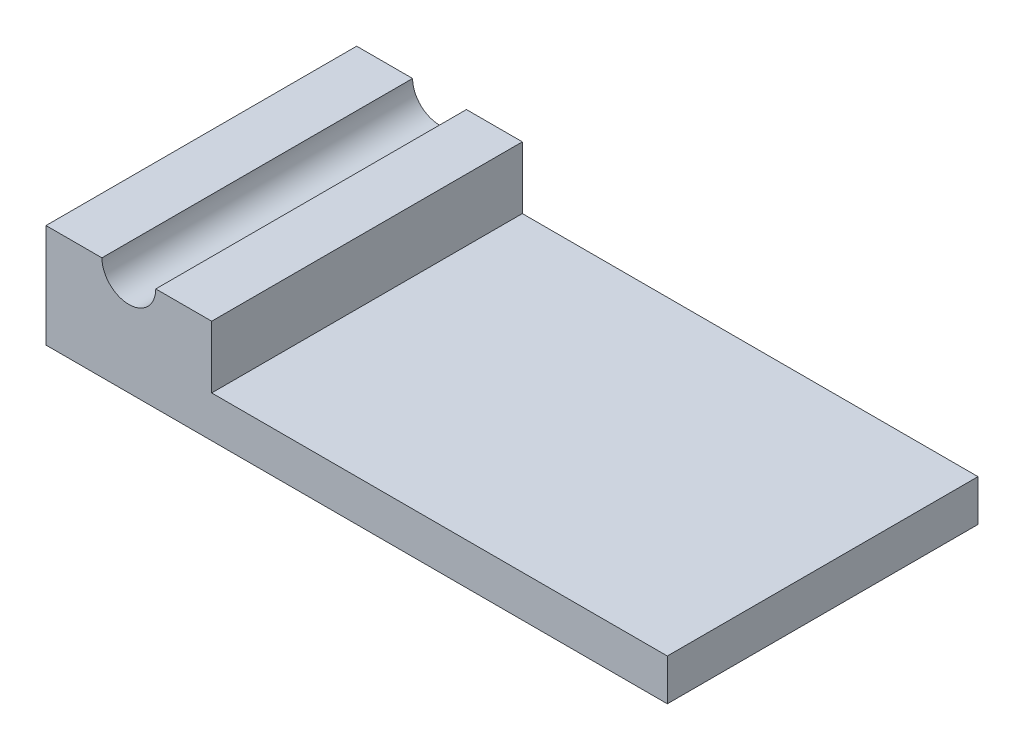
ISO-10303-21;
HEADER;
FILE_DESCRIPTION(('STEP AP214'),'2;1');
FILE_NAME('part.step','',(''),(''),'','','');
FILE_SCHEMA(('AUTOMOTIVE_DESIGN { 1 0 10303 214 1 1 1 1 }'));
ENDSEC;
DATA;
#1=APPLICATION_CONTEXT('core data for automotive mechanical design processes');
#2=APPLICATION_PROTOCOL_DEFINITION('international standard','automotive_design',2000,#1);
#3=PRODUCT_CONTEXT('',#1,'mechanical');
#4=PRODUCT('Part','Part','',(#3));
#5=PRODUCT_RELATED_PRODUCT_CATEGORY('part','',(#4));
#6=PRODUCT_DEFINITION_FORMATION('','',#4);
#7=PRODUCT_DEFINITION_CONTEXT('part definition',#1,'design');
#8=PRODUCT_DEFINITION('design','',#6,#7);
#9=PRODUCT_DEFINITION_SHAPE('','',#8);
#10=(LENGTH_UNIT() NAMED_UNIT(*) SI_UNIT(.MILLI.,.METRE.));
#11=(NAMED_UNIT(*) PLANE_ANGLE_UNIT() SI_UNIT($,.RADIAN.));
#12=(NAMED_UNIT(*) SI_UNIT($,.STERADIAN.) SOLID_ANGLE_UNIT());
#13=UNCERTAINTY_MEASURE_WITH_UNIT(LENGTH_MEASURE(1.E-05),#10,'distance_accuracy_value','');
#14=(GEOMETRIC_REPRESENTATION_CONTEXT(3) GLOBAL_UNCERTAINTY_ASSIGNED_CONTEXT((#13)) GLOBAL_UNIT_ASSIGNED_CONTEXT((#10,
#11,#12)) REPRESENTATION_CONTEXT('',''));
#15=CARTESIAN_POINT('',(0.,0.,0.));
#16=DIRECTION('',(0.,0.,1.));
#17=DIRECTION('',(1.,0.,0.));
#18=AXIS2_PLACEMENT_3D('',#15,#16,#17);
#19=CARTESIAN_POINT('',(30.,0.,15.));
#20=DIRECTION('',(0.,1.,0.));
#21=DIRECTION('',(-1.,0.,0.));
#22=AXIS2_PLACEMENT_3D('',#19,#20,#21);
#23=PLANE('',#22);
#24=CARTESIAN_POINT('',(15.,0.,7.5));
#25=DIRECTION('',(0.,1.,0.));
#26=DIRECTION('',(-1.,0.,0.));
#27=AXIS2_PLACEMENT_3D('',#24,#25,#26);
#28=CIRCLE('',#27,2.25);
#29=CARTESIAN_POINT('',(12.75,0.,7.5));
#30=VERTEX_POINT('',#29);
#31=EDGE_CURVE('E42',#30,#30,#28,.T.);
#32=ORIENTED_EDGE('',*,*,#31,.T.);
#33=EDGE_LOOP('',(#32));
#34=FACE_BOUND('',#33,.T.);
#35=DIRECTION('',(1.,0.,0.));
#36=VECTOR('',#35,1.);
#37=CARTESIAN_POINT('',(30.,0.,0.));
#38=LINE('',#37,#36);
#39=CARTESIAN_POINT('',(0.,0.,0.));
#40=VERTEX_POINT('',#39);
#41=CARTESIAN_POINT('',(30.,0.,0.));
#42=VERTEX_POINT('',#41);
#43=EDGE_CURVE('E131',#40,#42,#38,.T.);
#44=ORIENTED_EDGE('',*,*,#43,.T.);
#45=DIRECTION('',(0.,0.,-1.));
#46=VECTOR('',#45,1.);
#47=CARTESIAN_POINT('',(30.,0.,15.));
#48=LINE('',#47,#46);
#49=CARTESIAN_POINT('',(30.,0.,15.));
#50=VERTEX_POINT('',#49);
#51=EDGE_CURVE('E158',#50,#42,#48,.T.);
#52=ORIENTED_EDGE('',*,*,#51,.F.);
#53=DIRECTION('',(1.,0.,0.));
#54=VECTOR('',#53,1.);
#55=CARTESIAN_POINT('',(30.,0.,15.));
#56=LINE('',#55,#54);
#57=CARTESIAN_POINT('',(0.,0.,15.));
#58=VERTEX_POINT('',#57);
#59=EDGE_CURVE('E145',#58,#50,#56,.T.);
#60=ORIENTED_EDGE('',*,*,#59,.F.);
#61=DIRECTION('',(0.,0.,-1.));
#62=VECTOR('',#61,1.);
#63=CARTESIAN_POINT('',(0.,0.,15.));
#64=LINE('',#63,#62);
#65=EDGE_CURVE('E127',#58,#40,#64,.T.);
#66=ORIENTED_EDGE('',*,*,#65,.T.);
#67=EDGE_LOOP('',(#44,#52,#60,#66));
#68=FACE_BOUND('',#67,.T.);
#69=ADVANCED_FACE('F32',(#34,#68),#23,.F.);
#70=CARTESIAN_POINT('',(30.,0.,15.));
#71=DIRECTION('',(-1.,0.,0.));
#72=DIRECTION('',(0.,0.,1.));
#73=AXIS2_PLACEMENT_3D('',#70,#71,#72);
#74=PLANE('',#73);
#75=DIRECTION('',(0.,1.,0.));
#76=VECTOR('',#75,1.);
#77=CARTESIAN_POINT('',(30.,0.,0.));
#78=LINE('',#77,#76);
#79=CARTESIAN_POINT('',(30.,2.,0.));
#80=VERTEX_POINT('',#79);
#81=EDGE_CURVE('E134',#42,#80,#78,.T.);
#82=ORIENTED_EDGE('',*,*,#81,.T.);
#83=DIRECTION('',(0.,0.,-1.));
#84=VECTOR('',#83,1.);
#85=CARTESIAN_POINT('',(30.,2.,15.));
#86=LINE('',#85,#84);
#87=CARTESIAN_POINT('',(30.,2.,15.));
#88=VERTEX_POINT('',#87);
#89=EDGE_CURVE('E155',#88,#80,#86,.T.);
#90=ORIENTED_EDGE('',*,*,#89,.F.);
#91=DIRECTION('',(0.,1.,0.));
#92=VECTOR('',#91,1.);
#93=CARTESIAN_POINT('',(30.,0.,15.));
#94=LINE('',#93,#92);
#95=EDGE_CURVE('E94',#50,#88,#94,.T.);
#96=ORIENTED_EDGE('',*,*,#95,.F.);
#97=ORIENTED_EDGE('',*,*,#51,.T.);
#98=EDGE_LOOP('',(#82,#90,#96,#97));
#99=FACE_BOUND('',#98,.T.);
#100=ADVANCED_FACE('F182',(#99),#74,.F.);
#101=CARTESIAN_POINT('',(8.,2.,15.));
#102=DIRECTION('',(0.,-1.,0.));
#103=DIRECTION('',(1.,0.,0.));
#104=AXIS2_PLACEMENT_3D('',#101,#102,#103);
#105=PLANE('',#104);
#106=DIRECTION('',(-1.,0.,0.));
#107=VECTOR('',#106,1.);
#108=CARTESIAN_POINT('',(8.,2.,0.));
#109=LINE('',#108,#107);
#110=CARTESIAN_POINT('',(8.,2.,0.));
#111=VERTEX_POINT('',#110);
#112=EDGE_CURVE('E136',#80,#111,#109,.T.);
#113=ORIENTED_EDGE('',*,*,#112,.T.);
#114=DIRECTION('',(0.,0.,-1.));
#115=VECTOR('',#114,1.);
#116=CARTESIAN_POINT('',(8.,2.,15.));
#117=LINE('',#116,#115);
#118=CARTESIAN_POINT('',(8.,2.,15.));
#119=VERTEX_POINT('',#118);
#120=EDGE_CURVE('E152',#119,#111,#117,.T.);
#121=ORIENTED_EDGE('',*,*,#120,.F.);
#122=DIRECTION('',(-1.,0.,0.));
#123=VECTOR('',#122,1.);
#124=CARTESIAN_POINT('',(8.,2.,15.));
#125=LINE('',#124,#123);
#126=EDGE_CURVE('E291',#88,#119,#125,.T.);
#127=ORIENTED_EDGE('',*,*,#126,.F.);
#128=ORIENTED_EDGE('',*,*,#89,.T.);
#129=EDGE_LOOP('',(#113,#121,#127,#128));
#130=FACE_BOUND('',#129,.T.);
#131=ADVANCED_FACE('F187',(#130),#105,.F.);
#132=CARTESIAN_POINT('',(8.,5.,15.));
#133=DIRECTION('',(-1.,0.,0.));
#134=DIRECTION('',(0.,0.,1.));
#135=AXIS2_PLACEMENT_3D('',#132,#133,#134);
#136=PLANE('',#135);
#137=DIRECTION('',(0.,1.,0.));
#138=VECTOR('',#137,1.);
#139=CARTESIAN_POINT('',(8.,5.,0.));
#140=LINE('',#139,#138);
#141=CARTESIAN_POINT('',(8.,5.,0.));
#142=VERTEX_POINT('',#141);
#143=EDGE_CURVE('E138',#111,#142,#140,.T.);
#144=ORIENTED_EDGE('',*,*,#143,.T.);
#145=DIRECTION('',(0.,0.,-1.));
#146=VECTOR('',#145,1.);
#147=CARTESIAN_POINT('',(8.,5.,15.));
#148=LINE('',#147,#146);
#149=CARTESIAN_POINT('',(8.,5.,15.));
#150=VERTEX_POINT('',#149);
#151=EDGE_CURVE('E149',#150,#142,#148,.T.);
#152=ORIENTED_EDGE('',*,*,#151,.F.);
#153=DIRECTION('',(0.,1.,0.));
#154=VECTOR('',#153,1.);
#155=CARTESIAN_POINT('',(8.,5.,15.));
#156=LINE('',#155,#154);
#157=EDGE_CURVE('E295',#119,#150,#156,.T.);
#158=ORIENTED_EDGE('',*,*,#157,.F.);
#159=ORIENTED_EDGE('',*,*,#120,.T.);
#160=EDGE_LOOP('',(#144,#152,#158,#159));
#161=FACE_BOUND('',#160,.T.);
#162=ADVANCED_FACE('F192',(#161),#136,.F.);
#163=CARTESIAN_POINT('',(5.3,4.99999999999999,15.));
#164=DIRECTION('',(0.,-1.,0.));
#165=DIRECTION('',(1.,0.,0.));
#166=AXIS2_PLACEMENT_3D('',#163,#164,#165);
#167=PLANE('',#166);
#168=DIRECTION('',(-1.,0.,0.));
#169=VECTOR('',#168,1.);
#170=CARTESIAN_POINT('',(5.3,4.99999999999999,0.));
#171=LINE('',#170,#169);
#172=CARTESIAN_POINT('',(5.3,5.,0.));
#173=VERTEX_POINT('',#172);
#174=EDGE_CURVE('E140',#142,#173,#171,.T.);
#175=ORIENTED_EDGE('',*,*,#174,.T.);
#176=DIRECTION('',(0.,0.,-1.));
#177=VECTOR('',#176,1.);
#178=CARTESIAN_POINT('',(5.3,5.,15.));
#179=LINE('',#178,#177);
#180=CARTESIAN_POINT('',(5.3,5.,15.));
#181=VERTEX_POINT('',#180);
#182=EDGE_CURVE('E122',#181,#173,#179,.T.);
#183=ORIENTED_EDGE('',*,*,#182,.F.);
#184=DIRECTION('',(-1.,0.,0.));
#185=VECTOR('',#184,1.);
#186=CARTESIAN_POINT('',(5.3,4.99999999999999,15.));
#187=LINE('',#186,#185);
#188=EDGE_CURVE('E113',#150,#181,#187,.T.);
#189=ORIENTED_EDGE('',*,*,#188,.F.);
#190=ORIENTED_EDGE('',*,*,#151,.T.);
#191=EDGE_LOOP('',(#175,#183,#189,#190));
#192=FACE_BOUND('',#191,.T.);
#193=ADVANCED_FACE('F196',(#192),#167,.F.);
#194=CARTESIAN_POINT('',(4.,5.,15.));
#195=DIRECTION('',(0.,0.,-1.));
#196=DIRECTION('',(-1.,0.,0.));
#197=AXIS2_PLACEMENT_3D('',#194,#195,#196);
#198=CYLINDRICAL_SURFACE('',#197,1.3);
#199=CARTESIAN_POINT('',(4.,5.,0.));
#200=DIRECTION('',(0.,0.,-1.));
#201=DIRECTION('',(1.,0.,0.));
#202=AXIS2_PLACEMENT_3D('',#199,#200,#201);
#203=CIRCLE('',#202,1.3);
#204=CARTESIAN_POINT('',(2.7,5.,0.));
#205=VERTEX_POINT('',#204);
#206=EDGE_CURVE('E121',#173,#205,#203,.T.);
#207=ORIENTED_EDGE('',*,*,#206,.T.);
#208=DIRECTION('',(0.,0.,-1.));
#209=VECTOR('',#208,1.);
#210=CARTESIAN_POINT('',(2.7,5.,15.));
#211=LINE('',#210,#209);
#212=CARTESIAN_POINT('',(2.7,5.,15.));
#213=VERTEX_POINT('',#212);
#214=EDGE_CURVE('E118',#213,#205,#211,.T.);
#215=ORIENTED_EDGE('',*,*,#214,.F.);
#216=CARTESIAN_POINT('',(4.,5.,15.));
#217=DIRECTION('',(0.,0.,-1.));
#218=DIRECTION('',(1.,0.,0.));
#219=AXIS2_PLACEMENT_3D('',#216,#217,#218);
#220=CIRCLE('',#219,1.3);
#221=EDGE_CURVE('E107',#181,#213,#220,.T.);
#222=ORIENTED_EDGE('',*,*,#221,.F.);
#223=ORIENTED_EDGE('',*,*,#182,.T.);
#224=EDGE_LOOP('',(#207,#215,#222,#223));
#225=FACE_BOUND('',#224,.T.);
#226=ADVANCED_FACE('F119',(#225),#198,.F.);
#227=CARTESIAN_POINT('',(0.,5.,15.));
#228=DIRECTION('',(0.,-1.,0.));
#229=DIRECTION('',(1.,0.,0.));
#230=AXIS2_PLACEMENT_3D('',#227,#228,#229);
#231=PLANE('',#230);
#232=DIRECTION('',(-1.,0.,0.));
#233=VECTOR('',#232,1.);
#234=CARTESIAN_POINT('',(0.,5.,0.));
#235=LINE('',#234,#233);
#236=CARTESIAN_POINT('',(0.,5.,0.));
#237=VERTEX_POINT('',#236);
#238=EDGE_CURVE('E79',#205,#237,#235,.T.);
#239=ORIENTED_EDGE('',*,*,#238,.T.);
#240=DIRECTION('',(0.,0.,-1.));
#241=VECTOR('',#240,1.);
#242=CARTESIAN_POINT('',(0.,5.,15.));
#243=LINE('',#242,#241);
#244=CARTESIAN_POINT('',(0.,5.,15.));
#245=VERTEX_POINT('',#244);
#246=EDGE_CURVE('E123',#245,#237,#243,.T.);
#247=ORIENTED_EDGE('',*,*,#246,.F.);
#248=DIRECTION('',(-1.,0.,0.));
#249=VECTOR('',#248,1.);
#250=CARTESIAN_POINT('',(0.,5.,15.));
#251=LINE('',#250,#249);
#252=EDGE_CURVE('E111',#213,#245,#251,.T.);
#253=ORIENTED_EDGE('',*,*,#252,.F.);
#254=ORIENTED_EDGE('',*,*,#214,.T.);
#255=EDGE_LOOP('',(#239,#247,#253,#254));
#256=FACE_BOUND('',#255,.T.);
#257=ADVANCED_FACE('F125',(#256),#231,.F.);
#258=CARTESIAN_POINT('',(0.,0.,15.));
#259=DIRECTION('',(1.,0.,0.));
#260=DIRECTION('',(0.,0.,-1.));
#261=AXIS2_PLACEMENT_3D('',#258,#259,#260);
#262=PLANE('',#261);
#263=DIRECTION('',(0.,-1.,0.));
#264=VECTOR('',#263,1.);
#265=CARTESIAN_POINT('',(0.,0.,0.));
#266=LINE('',#265,#264);
#267=EDGE_CURVE('E85',#237,#40,#266,.T.);
#268=ORIENTED_EDGE('',*,*,#267,.T.);
#269=ORIENTED_EDGE('',*,*,#65,.F.);
#270=DIRECTION('',(0.,-1.,0.));
#271=VECTOR('',#270,1.);
#272=CARTESIAN_POINT('',(0.,0.,15.));
#273=LINE('',#272,#271);
#274=EDGE_CURVE('E50',#245,#58,#273,.T.);
#275=ORIENTED_EDGE('',*,*,#274,.F.);
#276=ORIENTED_EDGE('',*,*,#246,.T.);
#277=EDGE_LOOP('',(#268,#269,#275,#276));
#278=FACE_BOUND('',#277,.T.);
#279=ADVANCED_FACE('F205',(#278),#262,.F.);
#280=CARTESIAN_POINT('',(4.,5.,15.));
#281=DIRECTION('',(0.,0.,1.));
#282=DIRECTION('',(1.,0.,0.));
#283=AXIS2_PLACEMENT_3D('',#280,#281,#282);
#284=PLANE('',#283);
#285=ORIENTED_EDGE('',*,*,#59,.T.);
#286=ORIENTED_EDGE('',*,*,#95,.T.);
#287=ORIENTED_EDGE('',*,*,#126,.T.);
#288=ORIENTED_EDGE('',*,*,#157,.T.);
#289=ORIENTED_EDGE('',*,*,#188,.T.);
#290=ORIENTED_EDGE('',*,*,#221,.T.);
#291=ORIENTED_EDGE('',*,*,#252,.T.);
#292=ORIENTED_EDGE('',*,*,#274,.T.);
#293=EDGE_LOOP('',(#285,#286,#287,#288,#289,#290,#291,#292));
#294=FACE_BOUND('',#293,.T.);
#295=ADVANCED_FACE('F109',(#294),#284,.T.);
#296=CARTESIAN_POINT('',(4.,5.,0.));
#297=DIRECTION('',(0.,0.,1.));
#298=DIRECTION('',(1.,0.,0.));
#299=AXIS2_PLACEMENT_3D('',#296,#297,#298);
#300=PLANE('',#299);
#301=ORIENTED_EDGE('',*,*,#43,.F.);
#302=ORIENTED_EDGE('',*,*,#267,.F.);
#303=ORIENTED_EDGE('',*,*,#238,.F.);
#304=ORIENTED_EDGE('',*,*,#206,.F.);
#305=ORIENTED_EDGE('',*,*,#174,.F.);
#306=ORIENTED_EDGE('',*,*,#143,.F.);
#307=ORIENTED_EDGE('',*,*,#112,.F.);
#308=ORIENTED_EDGE('',*,*,#81,.F.);
#309=EDGE_LOOP('',(#301,#302,#303,#304,#305,#306,#307,#308));
#310=FACE_BOUND('',#309,.T.);
#311=ADVANCED_FACE('F177',(#310),#300,.F.);
#312=CARTESIAN_POINT('',(15.,1.,7.5));
#313=DIRECTION('',(0.,-1.,0.));
#314=DIRECTION('',(0.,0.,-1.));
#315=AXIS2_PLACEMENT_3D('',#312,#313,#314);
#316=PLANE('',#315);
#317=CARTESIAN_POINT('',(15.,1.,7.5));
#318=DIRECTION('',(0.,-1.,0.));
#319=DIRECTION('',(0.,0.,-1.));
#320=AXIS2_PLACEMENT_3D('',#317,#318,#319);
#321=CIRCLE('',#320,1.25);
#322=CARTESIAN_POINT('',(15.,1.,6.25));
#323=VERTEX_POINT('',#322);
#324=EDGE_CURVE('E11',#323,#323,#321,.T.);
#325=ORIENTED_EDGE('',*,*,#324,.T.);
#326=EDGE_LOOP('',(#325));
#327=FACE_BOUND('',#326,.T.);
#328=ADVANCED_FACE('F172',(#327),#316,.T.);
#329=CARTESIAN_POINT('',(15.,1.,7.5));
#330=DIRECTION('',(0.,-1.,0.));
#331=DIRECTION('',(0.,0.,-1.));
#332=AXIS2_PLACEMENT_3D('',#329,#330,#331);
#333=CONICAL_SURFACE('',#332,1.25,0.785398163397452);
#334=ORIENTED_EDGE('',*,*,#324,.F.);
#335=EDGE_LOOP('',(#334));
#336=FACE_BOUND('',#335,.T.);
#337=CARTESIAN_POINT('',(15.,0.500000000000008,7.5));
#338=DIRECTION('',(0.,-1.,0.));
#339=DIRECTION('',(0.,0.,-1.));
#340=AXIS2_PLACEMENT_3D('',#337,#338,#339);
#341=CIRCLE('',#340,1.75);
#342=CARTESIAN_POINT('',(15.,0.500000000000008,5.75));
#343=VERTEX_POINT('',#342);
#344=EDGE_CURVE('E36',#343,#343,#341,.F.);
#345=ORIENTED_EDGE('',*,*,#344,.F.);
#346=EDGE_LOOP('',(#345));
#347=FACE_BOUND('',#346,.T.);
#348=ADVANCED_FACE('F34',(#336,#347),#333,.F.);
#349=CARTESIAN_POINT('',(15.,0.500000000000003,7.5));
#350=DIRECTION('',(0.,-1.,0.));
#351=DIRECTION('',(0.,0.,-1.));
#352=AXIS2_PLACEMENT_3D('',#349,#350,#351);
#353=CONICAL_SURFACE('',#352,1.75,0.785398163397447);
#354=ORIENTED_EDGE('',*,*,#31,.F.);
#355=EDGE_LOOP('',(#354));
#356=FACE_BOUND('',#355,.T.);
#357=ORIENTED_EDGE('',*,*,#344,.T.);
#358=EDGE_LOOP('',(#357));
#359=FACE_BOUND('',#358,.T.);
#360=ADVANCED_FACE('F165',(#356,#359),#353,.F.);
#361=CLOSED_SHELL('',(#69,#100,#131,#162,#193,#226,#257,#279,#295,#311,#328,#348,#360));
#362=MANIFOLD_SOLID_BREP('B2',#361);
#363=ADVANCED_BREP_SHAPE_REPRESENTATION('',(#18,#362),#14);
#364=SHAPE_DEFINITION_REPRESENTATION(#9,#363);
ENDSEC;
END-ISO-10303-21;
